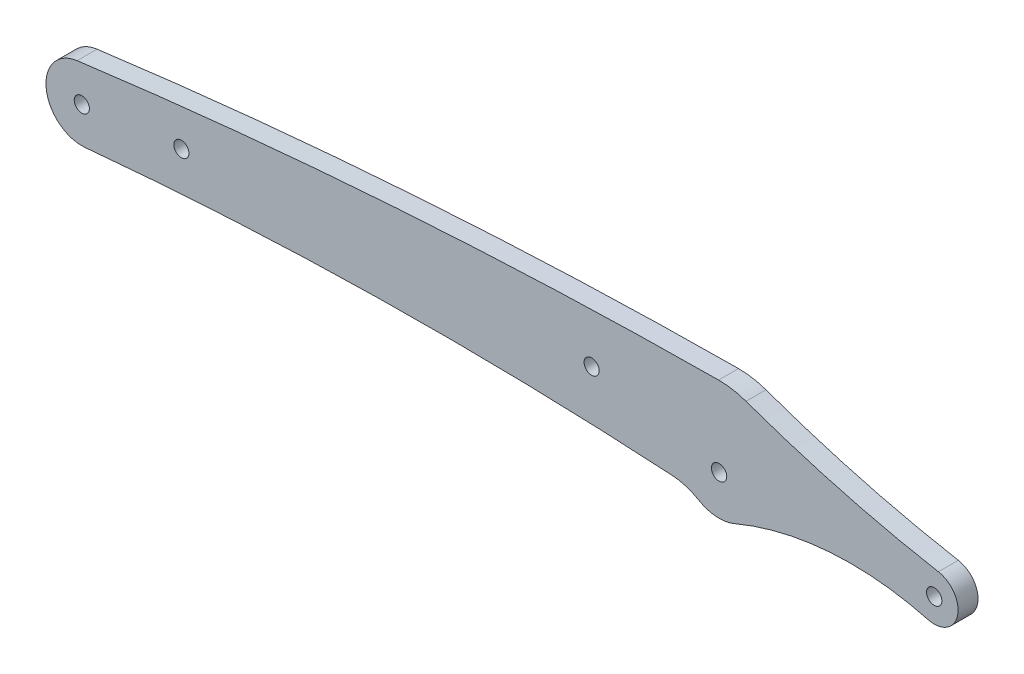
ISO-10303-21;
HEADER;
FILE_DESCRIPTION(('STEP AP214'),'2;1');
FILE_NAME('part.step','',(''),(''),'','','');
FILE_SCHEMA(('AUTOMOTIVE_DESIGN { 1 0 10303 214 1 1 1 1 }'));
ENDSEC;
DATA;
#1=APPLICATION_CONTEXT('core data for automotive mechanical design processes');
#2=APPLICATION_PROTOCOL_DEFINITION('international standard','automotive_design',2000,#1);
#3=PRODUCT_CONTEXT('',#1,'mechanical');
#4=PRODUCT('Part','Part','',(#3));
#5=PRODUCT_RELATED_PRODUCT_CATEGORY('part','',(#4));
#6=PRODUCT_DEFINITION_FORMATION('','',#4);
#7=PRODUCT_DEFINITION_CONTEXT('part definition',#1,'design');
#8=PRODUCT_DEFINITION('design','',#6,#7);
#9=PRODUCT_DEFINITION_SHAPE('','',#8);
#10=(LENGTH_UNIT() NAMED_UNIT(*) SI_UNIT(.MILLI.,.METRE.));
#11=(NAMED_UNIT(*) PLANE_ANGLE_UNIT() SI_UNIT($,.RADIAN.));
#12=(NAMED_UNIT(*) SI_UNIT($,.STERADIAN.) SOLID_ANGLE_UNIT());
#13=UNCERTAINTY_MEASURE_WITH_UNIT(LENGTH_MEASURE(1.E-05),#10,'distance_accuracy_value','');
#14=(GEOMETRIC_REPRESENTATION_CONTEXT(3) GLOBAL_UNCERTAINTY_ASSIGNED_CONTEXT((#13)) GLOBAL_UNIT_ASSIGNED_CONTEXT((#10,
#11,#12)) REPRESENTATION_CONTEXT('',''));
#15=CARTESIAN_POINT('',(0.,0.,0.));
#16=DIRECTION('',(0.,0.,1.));
#17=DIRECTION('',(1.,0.,0.));
#18=AXIS2_PLACEMENT_3D('',#15,#16,#17);
#19=CARTESIAN_POINT('',(-75.8109374999997,-639.986290287043,5.));
#20=DIRECTION('',(0.,0.,1.));
#21=DIRECTION('',(1.,0.,0.));
#22=AXIS2_PLACEMENT_3D('',#19,#20,#21);
#23=PLANE('',#22);
#24=CARTESIAN_POINT('',(108.148148148148,301.171011307739,5.));
#25=DIRECTION('',(0.,0.,-1.));
#26=DIRECTION('',(-1.,0.,0.));
#27=AXIS2_PLACEMENT_3D('',#24,#25,#26);
#28=CIRCLE('',#27,300.);
#29=CARTESIAN_POINT('',(55.0617283950617,5.90531394721056,5.));
#30=VERTEX_POINT('',#29);
#31=CARTESIAN_POINT('',(6.75925925925923,18.8231882067337,5.));
#32=VERTEX_POINT('',#31);
#33=EDGE_CURVE('E154',#30,#32,#28,.T.);
#34=ORIENTED_EDGE('',*,*,#33,.T.);
#35=CARTESIAN_POINT('',(0.,0.,5.));
#36=DIRECTION('',(0.,0.,-1.));
#37=DIRECTION('',(-1.,0.,0.));
#38=AXIS2_PLACEMENT_3D('',#35,#36,#37);
#39=CIRCLE('',#38,20.);
#40=CARTESIAN_POINT('',(-0.13090820312499,19.9995715714698,5.));
#41=VERTEX_POINT('',#40);
#42=EDGE_CURVE('E151',#41,#32,#39,.T.);
#43=ORIENTED_EDGE('',*,*,#42,.F.);
#44=CARTESIAN_POINT('',(8.37812500000069,-1279.97258057409,5.));
#45=DIRECTION('',(0.,0.,-1.));
#46=DIRECTION('',(-1.,0.,0.));
#47=AXIS2_PLACEMENT_3D('',#44,#45,#46);
#48=CIRCLE('',#47,1300.);
#49=CARTESIAN_POINT('',(-161.173821165763,8.92312410934673,5.));
#50=VERTEX_POINT('',#49);
#51=EDGE_CURVE('E92',#50,#41,#48,.T.);
#52=ORIENTED_EDGE('',*,*,#51,.F.);
#53=CARTESIAN_POINT('',(-160.,0.,5.));
#54=DIRECTION('',(0.,0.,-1.));
#55=DIRECTION('',(-1.,0.,0.));
#56=AXIS2_PLACEMENT_3D('',#53,#54,#55);
#57=CIRCLE('',#56,9.00000000000004);
#58=CARTESIAN_POINT('',(-159.155370177268,-8.96027903932412,5.));
#59=VERTEX_POINT('',#58);
#60=EDGE_CURVE('E84',#59,#50,#57,.T.);
#61=ORIENTED_EDGE('',*,*,#60,.F.);
#62=CARTESIAN_POINT('',(-69.9999999999999,-954.767510967984,5.));
#63=DIRECTION('',(0.,0.,-1.));
#64=DIRECTION('',(-1.,0.,0.));
#65=AXIS2_PLACEMENT_3D('',#62,#63,#64);
#66=CIRCLE('',#65,950.);
#67=CARTESIAN_POINT('',(-11.7980264080804,-6.55206589761131,5.));
#68=VERTEX_POINT('',#67);
#69=EDGE_CURVE('E89',#59,#68,#66,.T.);
#70=ORIENTED_EDGE('',*,*,#69,.T.);
#71=CARTESIAN_POINT('',(-12.7170049384792,-21.523888714512,5.));
#72=DIRECTION('',(0.,0.,-1.));
#73=DIRECTION('',(-1.,0.,0.));
#74=AXIS2_PLACEMENT_3D('',#71,#72,#73);
#75=CIRCLE('',#74,15.);
#76=CARTESIAN_POINT('',(-5.08680197539167,-8.6095554858048,5.));
#77=VERTEX_POINT('',#76);
#78=EDGE_CURVE('E167',#68,#77,#75,.T.);
#79=ORIENTED_EDGE('',*,*,#78,.T.);
#80=CARTESIAN_POINT('',(0.,0.,5.));
#81=DIRECTION('',(0.,0.,-1.));
#82=DIRECTION('',(-1.,0.,0.));
#83=AXIS2_PLACEMENT_3D('',#80,#81,#82);
#84=CIRCLE('',#83,10.);
#85=CARTESIAN_POINT('',(3.89978213507625,-9.2082408362803,5.));
#86=VERTEX_POINT('',#85);
#87=EDGE_CURVE('E164',#86,#77,#84,.T.);
#88=ORIENTED_EDGE('',*,*,#87,.F.);
#89=CARTESIAN_POINT('',(33.1481481481481,-78.2700471083825,5.));
#90=DIRECTION('',(0.,0.,-1.));
#91=DIRECTION('',(-1.,0.,0.));
#92=AXIS2_PLACEMENT_3D('',#89,#90,#91);
#93=CIRCLE('',#92,75.);
#94=CARTESIAN_POINT('',(52.4554183813443,-5.7977812672876,5.));
#95=VERTEX_POINT('',#94);
#96=EDGE_CURVE('E160',#86,#95,#93,.T.);
#97=ORIENTED_EDGE('',*,*,#96,.T.);
#98=CARTESIAN_POINT('',(54.,0.,5.));
#99=DIRECTION('',(0.,0.,-1.));
#100=DIRECTION('',(-1.,0.,0.));
#101=AXIS2_PLACEMENT_3D('',#98,#99,#100);
#102=CIRCLE('',#101,6.);
#103=EDGE_CURVE('E157',#30,#95,#102,.T.);
#104=ORIENTED_EDGE('',*,*,#103,.F.);
#105=EDGE_LOOP('',(#34,#43,#52,#61,#70,#79,#88,#97,#104));
#106=FACE_BOUND('',#105,.T.);
#107=CARTESIAN_POINT('',(-160.,0.,5.));
#108=DIRECTION('',(0.,0.,1.));
#109=DIRECTION('',(1.,0.,0.));
#110=AXIS2_PLACEMENT_3D('',#107,#108,#109);
#111=CIRCLE('',#110,1.90000000000001);
#112=CARTESIAN_POINT('',(-158.1,0.,5.));
#113=VERTEX_POINT('',#112);
#114=EDGE_CURVE('E98',#113,#113,#111,.F.);
#115=ORIENTED_EDGE('',*,*,#114,.T.);
#116=EDGE_LOOP('',(#115));
#117=FACE_BOUND('',#116,.T.);
#118=CARTESIAN_POINT('',(0.,0.,5.));
#119=DIRECTION('',(0.,0.,1.));
#120=DIRECTION('',(1.,0.,0.));
#121=AXIS2_PLACEMENT_3D('',#118,#119,#120);
#122=CIRCLE('',#121,1.925);
#123=CARTESIAN_POINT('',(1.925,0.,5.));
#124=VERTEX_POINT('',#123);
#125=EDGE_CURVE('E171',#124,#124,#122,.F.);
#126=ORIENTED_EDGE('',*,*,#125,.T.);
#127=EDGE_LOOP('',(#126));
#128=FACE_BOUND('',#127,.T.);
#129=CARTESIAN_POINT('',(54.,0.,5.));
#130=DIRECTION('',(0.,0.,1.));
#131=DIRECTION('',(1.,0.,0.));
#132=AXIS2_PLACEMENT_3D('',#129,#130,#131);
#133=CIRCLE('',#132,1.925);
#134=CARTESIAN_POINT('',(55.925,0.,5.));
#135=VERTEX_POINT('',#134);
#136=EDGE_CURVE('E174',#135,#135,#133,.F.);
#137=ORIENTED_EDGE('',*,*,#136,.T.);
#138=EDGE_LOOP('',(#137));
#139=FACE_BOUND('',#138,.T.);
#140=CARTESIAN_POINT('',(-135.,2.8,5.));
#141=DIRECTION('',(0.,0.,1.));
#142=DIRECTION('',(1.,0.,0.));
#143=AXIS2_PLACEMENT_3D('',#140,#141,#142);
#144=CIRCLE('',#143,1.90000000000001);
#145=CARTESIAN_POINT('',(-133.1,2.8,5.));
#146=VERTEX_POINT('',#145);
#147=EDGE_CURVE('E176',#146,#146,#144,.F.);
#148=ORIENTED_EDGE('',*,*,#147,.T.);
#149=EDGE_LOOP('',(#148));
#150=FACE_BOUND('',#149,.T.);
#151=CARTESIAN_POINT('',(-32.,7.,5.));
#152=DIRECTION('',(0.,0.,1.));
#153=DIRECTION('',(1.,0.,0.));
#154=AXIS2_PLACEMENT_3D('',#151,#152,#153);
#155=CIRCLE('',#154,1.9);
#156=CARTESIAN_POINT('',(-30.1,7.,5.));
#157=VERTEX_POINT('',#156);
#158=EDGE_CURVE('E20',#157,#157,#155,.F.);
#159=ORIENTED_EDGE('',*,*,#158,.T.);
#160=EDGE_LOOP('',(#159));
#161=FACE_BOUND('',#160,.T.);
#162=ADVANCED_FACE('F17',(#106,#117,#128,#139,#150,#161),#23,.T.);
#163=CARTESIAN_POINT('',(-32.,7.,-3.));
#164=DIRECTION('',(0.,0.,1.));
#165=DIRECTION('',(1.,0.,0.));
#166=AXIS2_PLACEMENT_3D('',#163,#164,#165);
#167=CYLINDRICAL_SURFACE('',#166,1.9);
#168=CARTESIAN_POINT('',(-32.,7.,0.));
#169=DIRECTION('',(0.,0.,1.));
#170=DIRECTION('',(1.,0.,0.));
#171=AXIS2_PLACEMENT_3D('',#168,#169,#170);
#172=CIRCLE('',#171,1.9);
#173=CARTESIAN_POINT('',(-30.1,7.,0.));
#174=VERTEX_POINT('',#173);
#175=EDGE_CURVE('E146',#174,#174,#172,.F.);
#176=ORIENTED_EDGE('',*,*,#175,.T.);
#177=EDGE_LOOP('',(#176));
#178=FACE_BOUND('',#177,.T.);
#179=ORIENTED_EDGE('',*,*,#158,.F.);
#180=EDGE_LOOP('',(#179));
#181=FACE_BOUND('',#180,.T.);
#182=ADVANCED_FACE('F184',(#178,#181),#167,.F.);
#183=CARTESIAN_POINT('',(-135.,2.8,-3.));
#184=DIRECTION('',(0.,0.,1.));
#185=DIRECTION('',(1.,0.,0.));
#186=AXIS2_PLACEMENT_3D('',#183,#184,#185);
#187=CYLINDRICAL_SURFACE('',#186,1.90000000000001);
#188=CARTESIAN_POINT('',(-135.,2.8,0.));
#189=DIRECTION('',(0.,0.,1.));
#190=DIRECTION('',(1.,0.,0.));
#191=AXIS2_PLACEMENT_3D('',#188,#189,#190);
#192=CIRCLE('',#191,1.90000000000001);
#193=CARTESIAN_POINT('',(-133.1,2.8,0.));
#194=VERTEX_POINT('',#193);
#195=EDGE_CURVE('E143',#194,#194,#192,.F.);
#196=ORIENTED_EDGE('',*,*,#195,.T.);
#197=EDGE_LOOP('',(#196));
#198=FACE_BOUND('',#197,.T.);
#199=ORIENTED_EDGE('',*,*,#147,.F.);
#200=EDGE_LOOP('',(#199));
#201=FACE_BOUND('',#200,.T.);
#202=ADVANCED_FACE('F186',(#198,#201),#187,.F.);
#203=CARTESIAN_POINT('',(54.,0.,-2.));
#204=DIRECTION('',(0.,0.,1.));
#205=DIRECTION('',(1.,0.,0.));
#206=AXIS2_PLACEMENT_3D('',#203,#204,#205);
#207=CYLINDRICAL_SURFACE('',#206,1.925);
#208=CARTESIAN_POINT('',(54.,0.,0.));
#209=DIRECTION('',(0.,0.,1.));
#210=DIRECTION('',(1.,0.,0.));
#211=AXIS2_PLACEMENT_3D('',#208,#209,#210);
#212=CIRCLE('',#211,1.925);
#213=CARTESIAN_POINT('',(55.925,0.,0.));
#214=VERTEX_POINT('',#213);
#215=EDGE_CURVE('E140',#214,#214,#212,.F.);
#216=ORIENTED_EDGE('',*,*,#215,.T.);
#217=EDGE_LOOP('',(#216));
#218=FACE_BOUND('',#217,.T.);
#219=ORIENTED_EDGE('',*,*,#136,.F.);
#220=EDGE_LOOP('',(#219));
#221=FACE_BOUND('',#220,.T.);
#222=ADVANCED_FACE('F193',(#218,#221),#207,.F.);
#223=CARTESIAN_POINT('',(0.,0.,-2.));
#224=DIRECTION('',(0.,0.,1.));
#225=DIRECTION('',(1.,0.,0.));
#226=AXIS2_PLACEMENT_3D('',#223,#224,#225);
#227=CYLINDRICAL_SURFACE('',#226,1.925);
#228=CARTESIAN_POINT('',(0.,0.,0.));
#229=DIRECTION('',(0.,0.,1.));
#230=DIRECTION('',(1.,0.,0.));
#231=AXIS2_PLACEMENT_3D('',#228,#229,#230);
#232=CIRCLE('',#231,1.925);
#233=CARTESIAN_POINT('',(1.925,0.,0.));
#234=VERTEX_POINT('',#233);
#235=EDGE_CURVE('E137',#234,#234,#232,.F.);
#236=ORIENTED_EDGE('',*,*,#235,.T.);
#237=EDGE_LOOP('',(#236));
#238=FACE_BOUND('',#237,.T.);
#239=ORIENTED_EDGE('',*,*,#125,.F.);
#240=EDGE_LOOP('',(#239));
#241=FACE_BOUND('',#240,.T.);
#242=ADVANCED_FACE('F239',(#238,#241),#227,.F.);
#243=CARTESIAN_POINT('',(-160.,0.,-2.));
#244=DIRECTION('',(0.,0.,1.));
#245=DIRECTION('',(1.,0.,0.));
#246=AXIS2_PLACEMENT_3D('',#243,#244,#245);
#247=CYLINDRICAL_SURFACE('',#246,1.90000000000001);
#248=CARTESIAN_POINT('',(-160.,0.,0.));
#249=DIRECTION('',(0.,0.,1.));
#250=DIRECTION('',(1.,0.,0.));
#251=AXIS2_PLACEMENT_3D('',#248,#249,#250);
#252=CIRCLE('',#251,1.90000000000001);
#253=CARTESIAN_POINT('',(-158.1,0.,0.));
#254=VERTEX_POINT('',#253);
#255=EDGE_CURVE('E134',#254,#254,#252,.F.);
#256=ORIENTED_EDGE('',*,*,#255,.T.);
#257=EDGE_LOOP('',(#256));
#258=FACE_BOUND('',#257,.T.);
#259=ORIENTED_EDGE('',*,*,#114,.F.);
#260=EDGE_LOOP('',(#259));
#261=FACE_BOUND('',#260,.T.);
#262=ADVANCED_FACE('F236',(#258,#261),#247,.F.);
#263=CARTESIAN_POINT('',(-160.,0.,5.));
#264=DIRECTION('',(0.,0.,-1.));
#265=DIRECTION('',(-1.,0.,0.));
#266=AXIS2_PLACEMENT_3D('',#263,#264,#265);
#267=CYLINDRICAL_SURFACE('',#266,9.00000000000004);
#268=CARTESIAN_POINT('',(-160.,0.,0.));
#269=DIRECTION('',(0.,0.,-1.));
#270=DIRECTION('',(-1.,0.,0.));
#271=AXIS2_PLACEMENT_3D('',#268,#269,#270);
#272=CIRCLE('',#271,9.00000000000004);
#273=CARTESIAN_POINT('',(-161.173821165763,8.92312410934673,0.));
#274=VERTEX_POINT('',#273);
#275=CARTESIAN_POINT('',(-159.155370177268,-8.96027903932406,0.));
#276=VERTEX_POINT('',#275);
#277=EDGE_CURVE('E109',#274,#276,#272,.F.);
#278=ORIENTED_EDGE('',*,*,#277,.T.);
#279=DIRECTION('',(0.,0.,-1.));
#280=VECTOR('',#279,1.);
#281=CARTESIAN_POINT('',(-159.155370177268,-8.96027903932406,5.));
#282=LINE('',#281,#280);
#283=EDGE_CURVE('E97',#276,#59,#282,.F.);
#284=ORIENTED_EDGE('',*,*,#283,.T.);
#285=ORIENTED_EDGE('',*,*,#60,.T.);
#286=DIRECTION('',(0.,0.,-1.));
#287=VECTOR('',#286,1.);
#288=CARTESIAN_POINT('',(-161.173821165763,8.92312410934659,5.));
#289=LINE('',#288,#287);
#290=EDGE_CURVE('E150',#274,#50,#289,.F.);
#291=ORIENTED_EDGE('',*,*,#290,.F.);
#292=EDGE_LOOP('',(#278,#284,#285,#291));
#293=FACE_BOUND('',#292,.T.);
#294=ADVANCED_FACE('F108',(#293),#267,.T.);
#295=CARTESIAN_POINT('',(-69.9999999999999,-954.767510967984,5.));
#296=DIRECTION('',(0.,0.,-1.));
#297=DIRECTION('',(-1.,0.,0.));
#298=AXIS2_PLACEMENT_3D('',#295,#296,#297);
#299=CYLINDRICAL_SURFACE('',#298,950.);
#300=DIRECTION('',(0.,0.,-1.));
#301=VECTOR('',#300,1.);
#302=CARTESIAN_POINT('',(-11.7980264080804,-6.55206589761137,5.));
#303=LINE('',#302,#301);
#304=CARTESIAN_POINT('',(-11.7980264080804,-6.55206589761137,0.));
#305=VERTEX_POINT('',#304);
#306=EDGE_CURVE('E106',#305,#68,#303,.F.);
#307=ORIENTED_EDGE('',*,*,#306,.T.);
#308=ORIENTED_EDGE('',*,*,#69,.F.);
#309=ORIENTED_EDGE('',*,*,#283,.F.);
#310=CARTESIAN_POINT('',(-69.9999999999999,-954.767510967984,0.));
#311=DIRECTION('',(0.,0.,-1.));
#312=DIRECTION('',(-1.,0.,0.));
#313=AXIS2_PLACEMENT_3D('',#310,#311,#312);
#314=CIRCLE('',#313,950.);
#315=EDGE_CURVE('E131',#276,#305,#314,.T.);
#316=ORIENTED_EDGE('',*,*,#315,.T.);
#317=EDGE_LOOP('',(#307,#308,#309,#316));
#318=FACE_BOUND('',#317,.T.);
#319=ADVANCED_FACE('F103',(#318),#299,.F.);
#320=CARTESIAN_POINT('',(-12.7170049384792,-21.523888714512,5.));
#321=DIRECTION('',(0.,0.,-1.));
#322=DIRECTION('',(-1.,0.,0.));
#323=AXIS2_PLACEMENT_3D('',#320,#321,#322);
#324=CYLINDRICAL_SURFACE('',#323,15.);
#325=ORIENTED_EDGE('',*,*,#306,.F.);
#326=CARTESIAN_POINT('',(-12.7170049384792,-21.523888714512,0.));
#327=DIRECTION('',(0.,0.,-1.));
#328=DIRECTION('',(-1.,0.,0.));
#329=AXIS2_PLACEMENT_3D('',#326,#327,#328);
#330=CIRCLE('',#329,15.);
#331=CARTESIAN_POINT('',(-5.08680197539167,-8.6095554858048,0.));
#332=VERTEX_POINT('',#331);
#333=EDGE_CURVE('E128',#305,#332,#330,.T.);
#334=ORIENTED_EDGE('',*,*,#333,.T.);
#335=DIRECTION('',(0.,0.,-1.));
#336=VECTOR('',#335,1.);
#337=CARTESIAN_POINT('',(-5.08680197539167,-8.6095554858048,5.));
#338=LINE('',#337,#336);
#339=EDGE_CURVE('E166',#77,#332,#338,.T.);
#340=ORIENTED_EDGE('',*,*,#339,.F.);
#341=ORIENTED_EDGE('',*,*,#78,.F.);
#342=EDGE_LOOP('',(#325,#334,#340,#341));
#343=FACE_BOUND('',#342,.T.);
#344=ADVANCED_FACE('F227',(#343),#324,.F.);
#345=CARTESIAN_POINT('',(0.,0.,5.));
#346=DIRECTION('',(0.,0.,-1.));
#347=DIRECTION('',(-1.,0.,0.));
#348=AXIS2_PLACEMENT_3D('',#345,#346,#347);
#349=CYLINDRICAL_SURFACE('',#348,10.);
#350=CARTESIAN_POINT('',(0.,0.,0.));
#351=DIRECTION('',(0.,0.,-1.));
#352=DIRECTION('',(-1.,0.,0.));
#353=AXIS2_PLACEMENT_3D('',#350,#351,#352);
#354=CIRCLE('',#353,10.);
#355=CARTESIAN_POINT('',(3.89978213507625,-9.20824083628029,0.));
#356=VERTEX_POINT('',#355);
#357=EDGE_CURVE('E125',#332,#356,#354,.F.);
#358=ORIENTED_EDGE('',*,*,#357,.T.);
#359=DIRECTION('',(0.,0.,-1.));
#360=VECTOR('',#359,1.);
#361=CARTESIAN_POINT('',(3.89978213507625,-9.20824083628029,5.));
#362=LINE('',#361,#360);
#363=EDGE_CURVE('E163',#356,#86,#362,.F.);
#364=ORIENTED_EDGE('',*,*,#363,.T.);
#365=ORIENTED_EDGE('',*,*,#87,.T.);
#366=ORIENTED_EDGE('',*,*,#339,.T.);
#367=EDGE_LOOP('',(#358,#364,#365,#366));
#368=FACE_BOUND('',#367,.T.);
#369=ADVANCED_FACE('F223',(#368),#349,.T.);
#370=CARTESIAN_POINT('',(33.1481481481481,-78.2700471083825,5.));
#371=DIRECTION('',(0.,0.,-1.));
#372=DIRECTION('',(-1.,0.,0.));
#373=AXIS2_PLACEMENT_3D('',#370,#371,#372);
#374=CYLINDRICAL_SURFACE('',#373,75.);
#375=DIRECTION('',(0.,0.,-1.));
#376=VECTOR('',#375,1.);
#377=CARTESIAN_POINT('',(52.4554183813443,-5.79778126728759,5.));
#378=LINE('',#377,#376);
#379=CARTESIAN_POINT('',(52.4554183813443,-5.7977812672876,0.));
#380=VERTEX_POINT('',#379);
#381=EDGE_CURVE('E159',#95,#380,#378,.T.);
#382=ORIENTED_EDGE('',*,*,#381,.F.);
#383=ORIENTED_EDGE('',*,*,#96,.F.);
#384=ORIENTED_EDGE('',*,*,#363,.F.);
#385=CARTESIAN_POINT('',(33.1481481481481,-78.2700471083825,0.));
#386=DIRECTION('',(0.,0.,-1.));
#387=DIRECTION('',(-1.,0.,0.));
#388=AXIS2_PLACEMENT_3D('',#385,#386,#387);
#389=CIRCLE('',#388,75.);
#390=EDGE_CURVE('E122',#356,#380,#389,.T.);
#391=ORIENTED_EDGE('',*,*,#390,.T.);
#392=EDGE_LOOP('',(#382,#383,#384,#391));
#393=FACE_BOUND('',#392,.T.);
#394=ADVANCED_FACE('F219',(#393),#374,.F.);
#395=CARTESIAN_POINT('',(54.,0.,5.));
#396=DIRECTION('',(0.,0.,-1.));
#397=DIRECTION('',(-1.,0.,0.));
#398=AXIS2_PLACEMENT_3D('',#395,#396,#397);
#399=CYLINDRICAL_SURFACE('',#398,6.);
#400=ORIENTED_EDGE('',*,*,#103,.T.);
#401=ORIENTED_EDGE('',*,*,#381,.T.);
#402=CARTESIAN_POINT('',(54.,0.,0.));
#403=DIRECTION('',(0.,0.,-1.));
#404=DIRECTION('',(-1.,0.,0.));
#405=AXIS2_PLACEMENT_3D('',#402,#403,#404);
#406=CIRCLE('',#405,6.);
#407=CARTESIAN_POINT('',(55.0617283950617,5.90531394721055,0.));
#408=VERTEX_POINT('',#407);
#409=EDGE_CURVE('E119',#380,#408,#406,.F.);
#410=ORIENTED_EDGE('',*,*,#409,.T.);
#411=DIRECTION('',(0.,0.,-1.));
#412=VECTOR('',#411,1.);
#413=CARTESIAN_POINT('',(55.0617283950617,5.90531394721055,5.));
#414=LINE('',#413,#412);
#415=EDGE_CURVE('E156',#408,#30,#414,.F.);
#416=ORIENTED_EDGE('',*,*,#415,.T.);
#417=EDGE_LOOP('',(#400,#401,#410,#416));
#418=FACE_BOUND('',#417,.T.);
#419=ADVANCED_FACE('F215',(#418),#399,.T.);
#420=CARTESIAN_POINT('',(108.148148148148,301.171011307739,5.));
#421=DIRECTION('',(0.,0.,-1.));
#422=DIRECTION('',(-1.,0.,0.));
#423=AXIS2_PLACEMENT_3D('',#420,#421,#422);
#424=CYLINDRICAL_SURFACE('',#423,300.);
#425=DIRECTION('',(0.,0.,-1.));
#426=VECTOR('',#425,1.);
#427=CARTESIAN_POINT('',(6.75925925925919,18.8231882067337,5.));
#428=LINE('',#427,#426);
#429=CARTESIAN_POINT('',(6.75925925925923,18.8231882067337,0.));
#430=VERTEX_POINT('',#429);
#431=EDGE_CURVE('E153',#32,#430,#428,.T.);
#432=ORIENTED_EDGE('',*,*,#431,.F.);
#433=ORIENTED_EDGE('',*,*,#33,.F.);
#434=ORIENTED_EDGE('',*,*,#415,.F.);
#435=CARTESIAN_POINT('',(108.148148148148,301.171011307739,0.));
#436=DIRECTION('',(0.,0.,-1.));
#437=DIRECTION('',(-1.,0.,0.));
#438=AXIS2_PLACEMENT_3D('',#435,#436,#437);
#439=CIRCLE('',#438,300.);
#440=EDGE_CURVE('E116',#408,#430,#439,.T.);
#441=ORIENTED_EDGE('',*,*,#440,.T.);
#442=EDGE_LOOP('',(#432,#433,#434,#441));
#443=FACE_BOUND('',#442,.T.);
#444=ADVANCED_FACE('F211',(#443),#424,.F.);
#445=CARTESIAN_POINT('',(0.,0.,5.));
#446=DIRECTION('',(0.,0.,-1.));
#447=DIRECTION('',(-1.,0.,0.));
#448=AXIS2_PLACEMENT_3D('',#445,#446,#447);
#449=CYLINDRICAL_SURFACE('',#448,20.);
#450=ORIENTED_EDGE('',*,*,#42,.T.);
#451=ORIENTED_EDGE('',*,*,#431,.T.);
#452=CARTESIAN_POINT('',(0.,0.,0.));
#453=DIRECTION('',(0.,0.,-1.));
#454=DIRECTION('',(-1.,0.,0.));
#455=AXIS2_PLACEMENT_3D('',#452,#453,#454);
#456=CIRCLE('',#455,20.);
#457=CARTESIAN_POINT('',(-0.13090820312499,19.9995715714698,0.));
#458=VERTEX_POINT('',#457);
#459=EDGE_CURVE('E26',#430,#458,#456,.F.);
#460=ORIENTED_EDGE('',*,*,#459,.T.);
#461=DIRECTION('',(0.,0.,-1.));
#462=VECTOR('',#461,1.);
#463=CARTESIAN_POINT('',(-0.130908203124971,19.9995715714698,5.));
#464=LINE('',#463,#462);
#465=EDGE_CURVE('E34',#41,#458,#464,.T.);
#466=ORIENTED_EDGE('',*,*,#465,.F.);
#467=EDGE_LOOP('',(#450,#451,#460,#466));
#468=FACE_BOUND('',#467,.T.);
#469=ADVANCED_FACE('F204',(#468),#449,.T.);
#470=CARTESIAN_POINT('',(8.37812500000069,-1279.97258057409,5.));
#471=DIRECTION('',(0.,0.,-1.));
#472=DIRECTION('',(-1.,0.,0.));
#473=AXIS2_PLACEMENT_3D('',#470,#471,#472);
#474=CYLINDRICAL_SURFACE('',#473,1300.);
#475=ORIENTED_EDGE('',*,*,#51,.T.);
#476=ORIENTED_EDGE('',*,*,#465,.T.);
#477=CARTESIAN_POINT('',(8.37812500000069,-1279.97258057409,0.));
#478=DIRECTION('',(0.,0.,-1.));
#479=DIRECTION('',(-1.,0.,0.));
#480=AXIS2_PLACEMENT_3D('',#477,#478,#479);
#481=CIRCLE('',#480,1300.);
#482=EDGE_CURVE('E11',#458,#274,#481,.F.);
#483=ORIENTED_EDGE('',*,*,#482,.T.);
#484=ORIENTED_EDGE('',*,*,#290,.T.);
#485=EDGE_LOOP('',(#475,#476,#483,#484));
#486=FACE_BOUND('',#485,.T.);
#487=ADVANCED_FACE('F198',(#486),#474,.T.);
#488=CARTESIAN_POINT('',(-75.8109374999997,-639.986290287043,0.));
#489=DIRECTION('',(0.,0.,1.));
#490=DIRECTION('',(1.,0.,0.));
#491=AXIS2_PLACEMENT_3D('',#488,#489,#490);
#492=PLANE('',#491);
#493=ORIENTED_EDGE('',*,*,#459,.F.);
#494=ORIENTED_EDGE('',*,*,#440,.F.);
#495=ORIENTED_EDGE('',*,*,#409,.F.);
#496=ORIENTED_EDGE('',*,*,#390,.F.);
#497=ORIENTED_EDGE('',*,*,#357,.F.);
#498=ORIENTED_EDGE('',*,*,#333,.F.);
#499=ORIENTED_EDGE('',*,*,#315,.F.);
#500=ORIENTED_EDGE('',*,*,#277,.F.);
#501=ORIENTED_EDGE('',*,*,#482,.F.);
#502=EDGE_LOOP('',(#493,#494,#495,#496,#497,#498,#499,#500,#501));
#503=FACE_BOUND('',#502,.T.);
#504=ORIENTED_EDGE('',*,*,#255,.F.);
#505=EDGE_LOOP('',(#504));
#506=FACE_BOUND('',#505,.T.);
#507=ORIENTED_EDGE('',*,*,#235,.F.);
#508=EDGE_LOOP('',(#507));
#509=FACE_BOUND('',#508,.T.);
#510=ORIENTED_EDGE('',*,*,#215,.F.);
#511=EDGE_LOOP('',(#510));
#512=FACE_BOUND('',#511,.T.);
#513=ORIENTED_EDGE('',*,*,#195,.F.);
#514=EDGE_LOOP('',(#513));
#515=FACE_BOUND('',#514,.T.);
#516=ORIENTED_EDGE('',*,*,#175,.F.);
#517=EDGE_LOOP('',(#516));
#518=FACE_BOUND('',#517,.T.);
#519=ADVANCED_FACE('F196',(#503,#506,#509,#512,#515,#518),#492,.F.);
#520=CLOSED_SHELL('',(#162,#182,#202,#222,#242,#262,#294,#319,#344,#369,#394,#419,#444,#469,
#487,#519));
#521=MANIFOLD_SOLID_BREP('B1',#520);
#522=ADVANCED_BREP_SHAPE_REPRESENTATION('',(#18,#521),#14);
#523=SHAPE_DEFINITION_REPRESENTATION(#9,#522);
ENDSEC;
END-ISO-10303-21;
